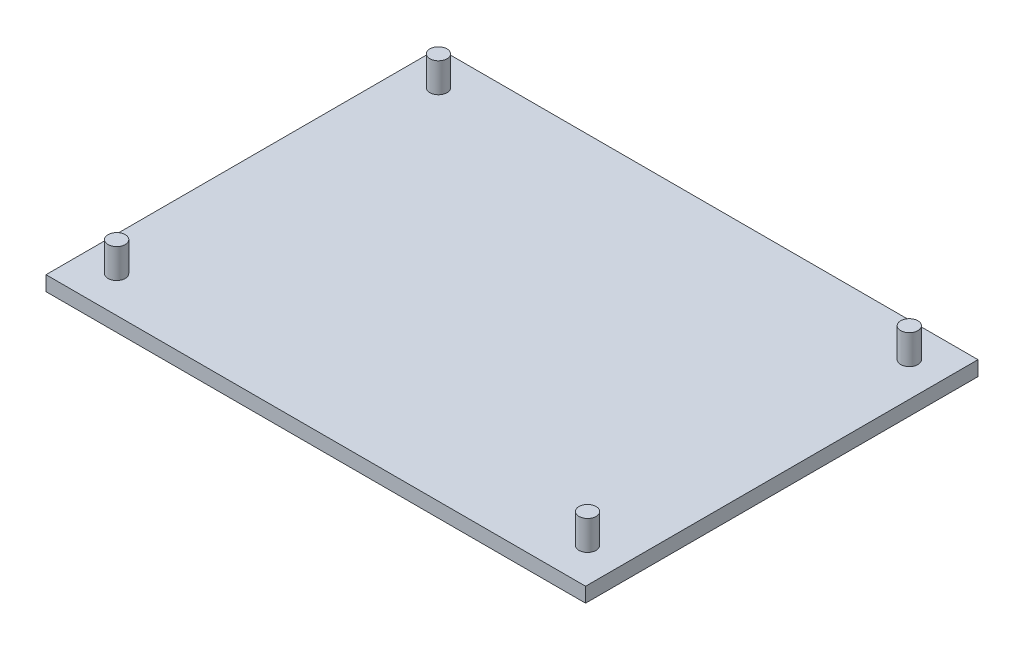
ISO-10303-21;
HEADER;
FILE_DESCRIPTION(('STEP AP214'),'2;1');
FILE_NAME('part.step','',(''),(''),'','','');
FILE_SCHEMA(('AUTOMOTIVE_DESIGN { 1 0 10303 214 1 1 1 1 }'));
ENDSEC;
DATA;
#1=APPLICATION_CONTEXT('core data for automotive mechanical design processes');
#2=APPLICATION_PROTOCOL_DEFINITION('international standard','automotive_design',2000,#1);
#3=PRODUCT_CONTEXT('',#1,'mechanical');
#4=PRODUCT('Part','Part','',(#3));
#5=PRODUCT_RELATED_PRODUCT_CATEGORY('part','',(#4));
#6=PRODUCT_DEFINITION_FORMATION('','',#4);
#7=PRODUCT_DEFINITION_CONTEXT('part definition',#1,'design');
#8=PRODUCT_DEFINITION('design','',#6,#7);
#9=PRODUCT_DEFINITION_SHAPE('','',#8);
#10=(LENGTH_UNIT() NAMED_UNIT(*) SI_UNIT(.MILLI.,.METRE.));
#11=(NAMED_UNIT(*) PLANE_ANGLE_UNIT() SI_UNIT($,.RADIAN.));
#12=(NAMED_UNIT(*) SI_UNIT($,.STERADIAN.) SOLID_ANGLE_UNIT());
#13=UNCERTAINTY_MEASURE_WITH_UNIT(LENGTH_MEASURE(1.E-05),#10,'distance_accuracy_value','');
#14=(GEOMETRIC_REPRESENTATION_CONTEXT(3) GLOBAL_UNCERTAINTY_ASSIGNED_CONTEXT((#13)) GLOBAL_UNIT_ASSIGNED_CONTEXT((#10,
#11,#12)) REPRESENTATION_CONTEXT('',''));
#15=CARTESIAN_POINT('',(0.,0.,0.));
#16=DIRECTION('',(0.,0.,1.));
#17=DIRECTION('',(1.,0.,0.));
#18=AXIS2_PLACEMENT_3D('',#15,#16,#17);
#19=CARTESIAN_POINT('',(55.,3.,40.));
#20=DIRECTION('',(-1.,0.,0.));
#21=DIRECTION('',(0.,0.,1.));
#22=AXIS2_PLACEMENT_3D('',#19,#20,#21);
#23=PLANE('',#22);
#24=DIRECTION('',(0.,0.,-1.));
#25=VECTOR('',#24,1.);
#26=CARTESIAN_POINT('',(55.,0.,40.));
#27=LINE('',#26,#25);
#28=CARTESIAN_POINT('',(55.,0.,40.));
#29=VERTEX_POINT('',#28);
#30=CARTESIAN_POINT('',(55.,0.,-40.));
#31=VERTEX_POINT('',#30);
#32=EDGE_CURVE('E111',#29,#31,#27,.T.);
#33=ORIENTED_EDGE('',*,*,#32,.T.);
#34=DIRECTION('',(0.,-1.,0.));
#35=VECTOR('',#34,1.);
#36=CARTESIAN_POINT('',(55.,3.,-40.));
#37=LINE('',#36,#35);
#38=CARTESIAN_POINT('',(55.,3.,-40.));
#39=VERTEX_POINT('',#38);
#40=EDGE_CURVE('E100',#39,#31,#37,.T.);
#41=ORIENTED_EDGE('',*,*,#40,.F.);
#42=DIRECTION('',(0.,0.,-1.));
#43=VECTOR('',#42,1.);
#44=CARTESIAN_POINT('',(55.,3.,40.));
#45=LINE('',#44,#43);
#46=CARTESIAN_POINT('',(55.,3.,40.));
#47=VERTEX_POINT('',#46);
#48=EDGE_CURVE('E92',#47,#39,#45,.T.);
#49=ORIENTED_EDGE('',*,*,#48,.F.);
#50=DIRECTION('',(0.,-1.,0.));
#51=VECTOR('',#50,1.);
#52=CARTESIAN_POINT('',(55.,3.,40.));
#53=LINE('',#52,#51);
#54=EDGE_CURVE('E107',#47,#29,#53,.T.);
#55=ORIENTED_EDGE('',*,*,#54,.T.);
#56=EDGE_LOOP('',(#33,#41,#49,#55));
#57=FACE_BOUND('',#56,.T.);
#58=ADVANCED_FACE('F39',(#57),#23,.F.);
#59=CARTESIAN_POINT('',(-55.,3.,-40.));
#60=DIRECTION('',(0.,0.,1.));
#61=DIRECTION('',(1.,0.,0.));
#62=AXIS2_PLACEMENT_3D('',#59,#60,#61);
#63=PLANE('',#62);
#64=DIRECTION('',(-1.,0.,0.));
#65=VECTOR('',#64,1.);
#66=CARTESIAN_POINT('',(-55.,0.,-40.));
#67=LINE('',#66,#65);
#68=CARTESIAN_POINT('',(-55.,0.,-40.));
#69=VERTEX_POINT('',#68);
#70=EDGE_CURVE('E98',#31,#69,#67,.T.);
#71=ORIENTED_EDGE('',*,*,#70,.T.);
#72=DIRECTION('',(0.,-1.,0.));
#73=VECTOR('',#72,1.);
#74=CARTESIAN_POINT('',(-55.,3.,-40.));
#75=LINE('',#74,#73);
#76=CARTESIAN_POINT('',(-55.,3.,-40.));
#77=VERTEX_POINT('',#76);
#78=EDGE_CURVE('E96',#77,#69,#75,.T.);
#79=ORIENTED_EDGE('',*,*,#78,.F.);
#80=DIRECTION('',(-1.,0.,0.));
#81=VECTOR('',#80,1.);
#82=CARTESIAN_POINT('',(-55.,3.,-40.));
#83=LINE('',#82,#81);
#84=EDGE_CURVE('E87',#39,#77,#83,.T.);
#85=ORIENTED_EDGE('',*,*,#84,.F.);
#86=ORIENTED_EDGE('',*,*,#40,.T.);
#87=EDGE_LOOP('',(#71,#79,#85,#86));
#88=FACE_BOUND('',#87,.T.);
#89=ADVANCED_FACE('F97',(#88),#63,.F.);
#90=CARTESIAN_POINT('',(-55.,3.,40.));
#91=DIRECTION('',(1.,0.,0.));
#92=DIRECTION('',(0.,0.,-1.));
#93=AXIS2_PLACEMENT_3D('',#90,#91,#92);
#94=PLANE('',#93);
#95=DIRECTION('',(0.,0.,1.));
#96=VECTOR('',#95,1.);
#97=CARTESIAN_POINT('',(-55.,0.,40.));
#98=LINE('',#97,#96);
#99=CARTESIAN_POINT('',(-55.,0.,40.));
#100=VERTEX_POINT('',#99);
#101=EDGE_CURVE('E73',#69,#100,#98,.T.);
#102=ORIENTED_EDGE('',*,*,#101,.T.);
#103=DIRECTION('',(0.,-1.,0.));
#104=VECTOR('',#103,1.);
#105=CARTESIAN_POINT('',(-55.,3.,40.));
#106=LINE('',#105,#104);
#107=CARTESIAN_POINT('',(-55.,3.,40.));
#108=VERTEX_POINT('',#107);
#109=EDGE_CURVE('E101',#108,#100,#106,.T.);
#110=ORIENTED_EDGE('',*,*,#109,.F.);
#111=DIRECTION('',(0.,0.,1.));
#112=VECTOR('',#111,1.);
#113=CARTESIAN_POINT('',(-55.,3.,40.));
#114=LINE('',#113,#112);
#115=EDGE_CURVE('E90',#77,#108,#114,.T.);
#116=ORIENTED_EDGE('',*,*,#115,.F.);
#117=ORIENTED_EDGE('',*,*,#78,.T.);
#118=EDGE_LOOP('',(#102,#110,#116,#117));
#119=FACE_BOUND('',#118,.T.);
#120=ADVANCED_FACE('F103',(#119),#94,.F.);
#121=CARTESIAN_POINT('',(-55.,3.,40.));
#122=DIRECTION('',(0.,0.,-1.));
#123=DIRECTION('',(-1.,0.,0.));
#124=AXIS2_PLACEMENT_3D('',#121,#122,#123);
#125=PLANE('',#124);
#126=DIRECTION('',(1.,0.,0.));
#127=VECTOR('',#126,1.);
#128=CARTESIAN_POINT('',(-55.,0.,40.));
#129=LINE('',#128,#127);
#130=EDGE_CURVE('E79',#100,#29,#129,.T.);
#131=ORIENTED_EDGE('',*,*,#130,.T.);
#132=ORIENTED_EDGE('',*,*,#54,.F.);
#133=DIRECTION('',(1.,0.,0.));
#134=VECTOR('',#133,1.);
#135=CARTESIAN_POINT('',(-55.,3.,40.));
#136=LINE('',#135,#134);
#137=EDGE_CURVE('E56',#108,#47,#136,.T.);
#138=ORIENTED_EDGE('',*,*,#137,.F.);
#139=ORIENTED_EDGE('',*,*,#109,.T.);
#140=EDGE_LOOP('',(#131,#132,#138,#139));
#141=FACE_BOUND('',#140,.T.);
#142=ADVANCED_FACE('F144',(#141),#125,.F.);
#143=CARTESIAN_POINT('',(0.,3.,0.));
#144=DIRECTION('',(0.,-1.,0.));
#145=DIRECTION('',(0.,0.,-1.));
#146=AXIS2_PLACEMENT_3D('',#143,#144,#145);
#147=PLANE('',#146);
#148=CARTESIAN_POINT('',(48.,3.,-33.));
#149=DIRECTION('',(0.,-1.,0.));
#150=DIRECTION('',(0.,0.,-1.));
#151=AXIS2_PLACEMENT_3D('',#148,#149,#150);
#152=CIRCLE('',#151,1.75);
#153=CARTESIAN_POINT('',(48.,3.,-34.75));
#154=VERTEX_POINT('',#153);
#155=EDGE_CURVE('E11',#154,#154,#152,.F.);
#156=ORIENTED_EDGE('',*,*,#155,.F.);
#157=EDGE_LOOP('',(#156));
#158=FACE_BOUND('',#157,.T.);
#159=CARTESIAN_POINT('',(48.,3.,32.6));
#160=DIRECTION('',(0.,-1.,0.));
#161=DIRECTION('',(0.,0.,-1.));
#162=AXIS2_PLACEMENT_3D('',#159,#160,#161);
#163=CIRCLE('',#162,1.75);
#164=CARTESIAN_POINT('',(48.,3.,30.85));
#165=VERTEX_POINT('',#164);
#166=EDGE_CURVE('E48',#165,#165,#163,.F.);
#167=ORIENTED_EDGE('',*,*,#166,.F.);
#168=EDGE_LOOP('',(#167));
#169=FACE_BOUND('',#168,.T.);
#170=CARTESIAN_POINT('',(-48.,3.,32.6));
#171=DIRECTION('',(0.,-1.,0.));
#172=DIRECTION('',(0.,0.,-1.));
#173=AXIS2_PLACEMENT_3D('',#170,#171,#172);
#174=CIRCLE('',#173,1.75);
#175=CARTESIAN_POINT('',(-48.,3.,30.85));
#176=VERTEX_POINT('',#175);
#177=EDGE_CURVE('E132',#176,#176,#174,.F.);
#178=ORIENTED_EDGE('',*,*,#177,.F.);
#179=EDGE_LOOP('',(#178));
#180=FACE_BOUND('',#179,.T.);
#181=CARTESIAN_POINT('',(-48.,3.,-33.));
#182=DIRECTION('',(0.,-1.,0.));
#183=DIRECTION('',(0.,0.,-1.));
#184=AXIS2_PLACEMENT_3D('',#181,#182,#183);
#185=CIRCLE('',#184,1.75);
#186=CARTESIAN_POINT('',(-48.,3.,-34.75));
#187=VERTEX_POINT('',#186);
#188=EDGE_CURVE('E128',#187,#187,#185,.F.);
#189=ORIENTED_EDGE('',*,*,#188,.F.);
#190=EDGE_LOOP('',(#189));
#191=FACE_BOUND('',#190,.T.);
#192=ORIENTED_EDGE('',*,*,#48,.T.);
#193=ORIENTED_EDGE('',*,*,#84,.T.);
#194=ORIENTED_EDGE('',*,*,#115,.T.);
#195=ORIENTED_EDGE('',*,*,#137,.T.);
#196=EDGE_LOOP('',(#192,#193,#194,#195));
#197=FACE_BOUND('',#196,.T.);
#198=ADVANCED_FACE('F88',(#158,#169,#180,#191,#197),#147,.F.);
#199=CARTESIAN_POINT('',(0.,0.,0.));
#200=DIRECTION('',(0.,-1.,0.));
#201=DIRECTION('',(0.,0.,-1.));
#202=AXIS2_PLACEMENT_3D('',#199,#200,#201);
#203=PLANE('',#202);
#204=ORIENTED_EDGE('',*,*,#32,.F.);
#205=ORIENTED_EDGE('',*,*,#130,.F.);
#206=ORIENTED_EDGE('',*,*,#101,.F.);
#207=ORIENTED_EDGE('',*,*,#70,.F.);
#208=EDGE_LOOP('',(#204,#205,#206,#207));
#209=FACE_BOUND('',#208,.T.);
#210=ADVANCED_FACE('F143',(#209),#203,.T.);
#211=CARTESIAN_POINT('',(-48.,9.,-33.));
#212=DIRECTION('',(0.,-1.,0.));
#213=DIRECTION('',(0.,0.,-1.));
#214=AXIS2_PLACEMENT_3D('',#211,#212,#213);
#215=CYLINDRICAL_SURFACE('',#214,1.75);
#216=CARTESIAN_POINT('',(-48.,9.,-33.));
#217=DIRECTION('',(0.,1.,0.));
#218=DIRECTION('',(0.,0.,1.));
#219=AXIS2_PLACEMENT_3D('',#216,#217,#218);
#220=CIRCLE('',#219,1.75);
#221=CARTESIAN_POINT('',(-48.,9.,-31.25));
#222=VERTEX_POINT('',#221);
#223=EDGE_CURVE('E115',#222,#222,#220,.T.);
#224=ORIENTED_EDGE('',*,*,#223,.F.);
#225=EDGE_LOOP('',(#224));
#226=FACE_BOUND('',#225,.T.);
#227=ORIENTED_EDGE('',*,*,#188,.T.);
#228=EDGE_LOOP('',(#227));
#229=FACE_BOUND('',#228,.T.);
#230=ADVANCED_FACE('F151',(#226,#229),#215,.T.);
#231=CARTESIAN_POINT('',(-48.,9.,-33.));
#232=DIRECTION('',(0.,1.,0.));
#233=DIRECTION('',(0.,0.,1.));
#234=AXIS2_PLACEMENT_3D('',#231,#232,#233);
#235=PLANE('',#234);
#236=ORIENTED_EDGE('',*,*,#223,.T.);
#237=EDGE_LOOP('',(#236));
#238=FACE_BOUND('',#237,.T.);
#239=ADVANCED_FACE('F153',(#238),#235,.T.);
#240=CARTESIAN_POINT('',(-48.,9.,32.6));
#241=DIRECTION('',(0.,-1.,0.));
#242=DIRECTION('',(0.,0.,-1.));
#243=AXIS2_PLACEMENT_3D('',#240,#241,#242);
#244=CYLINDRICAL_SURFACE('',#243,1.75);
#245=CARTESIAN_POINT('',(-48.,9.,32.6));
#246=DIRECTION('',(0.,1.,0.));
#247=DIRECTION('',(0.,0.,1.));
#248=AXIS2_PLACEMENT_3D('',#245,#246,#247);
#249=CIRCLE('',#248,1.75);
#250=CARTESIAN_POINT('',(-48.,9.,34.35));
#251=VERTEX_POINT('',#250);
#252=EDGE_CURVE('E284',#251,#251,#249,.T.);
#253=ORIENTED_EDGE('',*,*,#252,.F.);
#254=EDGE_LOOP('',(#253));
#255=FACE_BOUND('',#254,.T.);
#256=ORIENTED_EDGE('',*,*,#177,.T.);
#257=EDGE_LOOP('',(#256));
#258=FACE_BOUND('',#257,.T.);
#259=ADVANCED_FACE('F160',(#255,#258),#244,.T.);
#260=CARTESIAN_POINT('',(-48.,9.,32.6));
#261=DIRECTION('',(0.,1.,0.));
#262=DIRECTION('',(0.,0.,1.));
#263=AXIS2_PLACEMENT_3D('',#260,#261,#262);
#264=PLANE('',#263);
#265=ORIENTED_EDGE('',*,*,#252,.T.);
#266=EDGE_LOOP('',(#265));
#267=FACE_BOUND('',#266,.T.);
#268=ADVANCED_FACE('F223',(#267),#264,.T.);
#269=CARTESIAN_POINT('',(48.,9.,32.6));
#270=DIRECTION('',(0.,-1.,0.));
#271=DIRECTION('',(0.,0.,-1.));
#272=AXIS2_PLACEMENT_3D('',#269,#270,#271);
#273=CYLINDRICAL_SURFACE('',#272,1.75);
#274=CARTESIAN_POINT('',(48.,9.,32.6));
#275=DIRECTION('',(0.,1.,0.));
#276=DIRECTION('',(0.,0.,1.));
#277=AXIS2_PLACEMENT_3D('',#274,#275,#276);
#278=CIRCLE('',#277,1.75);
#279=CARTESIAN_POINT('',(48.,9.,34.35));
#280=VERTEX_POINT('',#279);
#281=EDGE_CURVE('E280',#280,#280,#278,.T.);
#282=ORIENTED_EDGE('',*,*,#281,.F.);
#283=EDGE_LOOP('',(#282));
#284=FACE_BOUND('',#283,.T.);
#285=ORIENTED_EDGE('',*,*,#166,.T.);
#286=EDGE_LOOP('',(#285));
#287=FACE_BOUND('',#286,.T.);
#288=ADVANCED_FACE('F139',(#284,#287),#273,.T.);
#289=CARTESIAN_POINT('',(48.,9.,32.6));
#290=DIRECTION('',(0.,1.,0.));
#291=DIRECTION('',(0.,0.,1.));
#292=AXIS2_PLACEMENT_3D('',#289,#290,#291);
#293=PLANE('',#292);
#294=ORIENTED_EDGE('',*,*,#281,.T.);
#295=EDGE_LOOP('',(#294));
#296=FACE_BOUND('',#295,.T.);
#297=ADVANCED_FACE('F240',(#296),#293,.T.);
#298=CARTESIAN_POINT('',(48.,9.,-33.));
#299=DIRECTION('',(0.,-1.,0.));
#300=DIRECTION('',(0.,0.,-1.));
#301=AXIS2_PLACEMENT_3D('',#298,#299,#300);
#302=CYLINDRICAL_SURFACE('',#301,1.75);
#303=CARTESIAN_POINT('',(48.,9.,-33.));
#304=DIRECTION('',(0.,1.,0.));
#305=DIRECTION('',(0.,0.,1.));
#306=AXIS2_PLACEMENT_3D('',#303,#304,#305);
#307=CIRCLE('',#306,1.75);
#308=CARTESIAN_POINT('',(48.,9.,-31.25));
#309=VERTEX_POINT('',#308);
#310=EDGE_CURVE('E278',#309,#309,#307,.T.);
#311=ORIENTED_EDGE('',*,*,#310,.F.);
#312=EDGE_LOOP('',(#311));
#313=FACE_BOUND('',#312,.T.);
#314=ORIENTED_EDGE('',*,*,#155,.T.);
#315=EDGE_LOOP('',(#314));
#316=FACE_BOUND('',#315,.T.);
#317=ADVANCED_FACE('F249',(#313,#316),#302,.T.);
#318=CARTESIAN_POINT('',(48.,9.,-33.));
#319=DIRECTION('',(0.,1.,0.));
#320=DIRECTION('',(0.,0.,1.));
#321=AXIS2_PLACEMENT_3D('',#318,#319,#320);
#322=PLANE('',#321);
#323=ORIENTED_EDGE('',*,*,#310,.T.);
#324=EDGE_LOOP('',(#323));
#325=FACE_BOUND('',#324,.T.);
#326=ADVANCED_FACE('F258',(#325),#322,.T.);
#327=CLOSED_SHELL('',(#58,#89,#120,#142,#198,#210,#230,#239,#259,#268,#288,#297,#317,#326));
#328=MANIFOLD_SOLID_BREP('B2',#327);
#329=ADVANCED_BREP_SHAPE_REPRESENTATION('',(#18,#328),#14);
#330=SHAPE_DEFINITION_REPRESENTATION(#9,#329);
ENDSEC;
END-ISO-10303-21;
